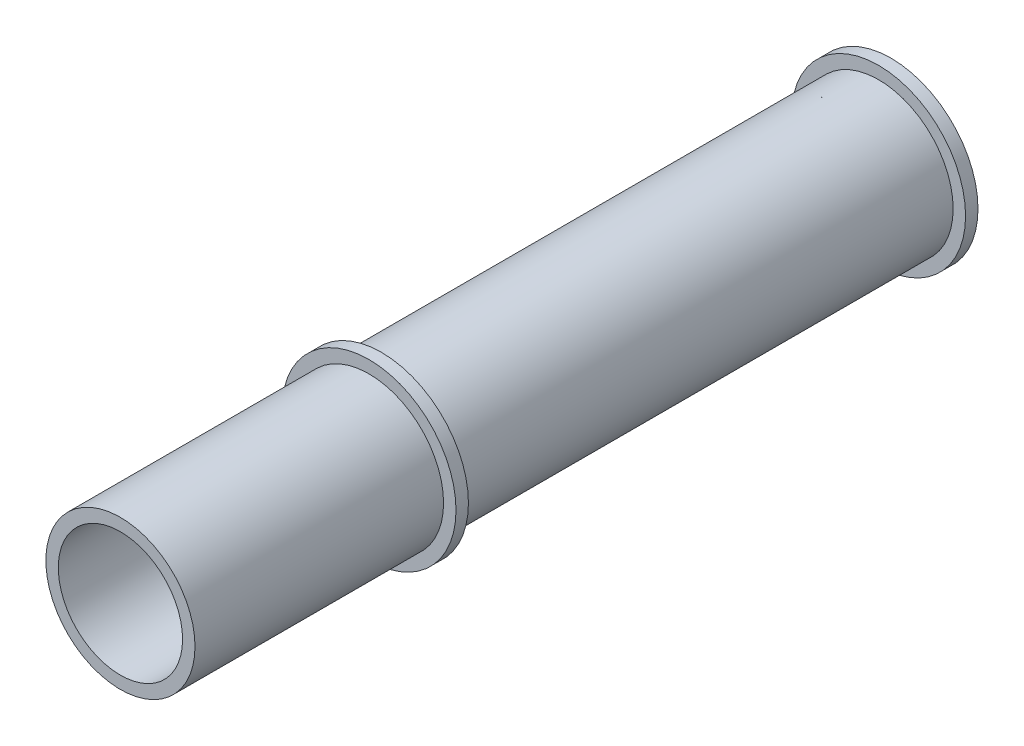
ISO-10303-21;
HEADER;
FILE_DESCRIPTION(('STEP AP214'),'2;1');
FILE_NAME('part.step','',(''),(''),'','','');
FILE_SCHEMA(('AUTOMOTIVE_DESIGN { 1 0 10303 214 1 1 1 1 }'));
ENDSEC;
DATA;
#1=APPLICATION_CONTEXT('core data for automotive mechanical design processes');
#2=APPLICATION_PROTOCOL_DEFINITION('international standard','automotive_design',2000,#1);
#3=PRODUCT_CONTEXT('',#1,'mechanical');
#4=PRODUCT('Part','Part','',(#3));
#5=PRODUCT_RELATED_PRODUCT_CATEGORY('part','',(#4));
#6=PRODUCT_DEFINITION_FORMATION('','',#4);
#7=PRODUCT_DEFINITION_CONTEXT('part definition',#1,'design');
#8=PRODUCT_DEFINITION('design','',#6,#7);
#9=PRODUCT_DEFINITION_SHAPE('','',#8);
#10=(LENGTH_UNIT() NAMED_UNIT(*) SI_UNIT(.MILLI.,.METRE.));
#11=(NAMED_UNIT(*) PLANE_ANGLE_UNIT() SI_UNIT($,.RADIAN.));
#12=(NAMED_UNIT(*) SI_UNIT($,.STERADIAN.) SOLID_ANGLE_UNIT());
#13=UNCERTAINTY_MEASURE_WITH_UNIT(LENGTH_MEASURE(1.E-05),#10,'distance_accuracy_value','');
#14=(GEOMETRIC_REPRESENTATION_CONTEXT(3) GLOBAL_UNCERTAINTY_ASSIGNED_CONTEXT((#13)) GLOBAL_UNIT_ASSIGNED_CONTEXT((#10,
#11,#12)) REPRESENTATION_CONTEXT('',''));
#15=CARTESIAN_POINT('',(0.,0.,0.));
#16=DIRECTION('',(0.,0.,1.));
#17=DIRECTION('',(1.,0.,0.));
#18=AXIS2_PLACEMENT_3D('',#15,#16,#17);
#19=CARTESIAN_POINT('',(0.,0.,40.));
#20=DIRECTION('',(0.,0.,-1.));
#21=DIRECTION('',(-1.,0.,0.));
#22=AXIS2_PLACEMENT_3D('',#19,#20,#21);
#23=CYLINDRICAL_SURFACE('',#22,6.);
#24=CARTESIAN_POINT('',(0.,0.,40.));
#25=DIRECTION('',(0.,0.,1.));
#26=DIRECTION('',(1.,0.,0.));
#27=AXIS2_PLACEMENT_3D('',#24,#25,#26);
#28=CIRCLE('',#27,6.);
#29=CARTESIAN_POINT('',(6.,0.,40.));
#30=VERTEX_POINT('',#29);
#31=EDGE_CURVE('E38',#30,#30,#28,.T.);
#32=ORIENTED_EDGE('',*,*,#31,.F.);
#33=EDGE_LOOP('',(#32));
#34=FACE_BOUND('',#33,.T.);
#35=CARTESIAN_POINT('',(0.,0.,0.));
#36=DIRECTION('',(0.,0.,1.));
#37=DIRECTION('',(1.,0.,0.));
#38=AXIS2_PLACEMENT_3D('',#35,#36,#37);
#39=CIRCLE('',#38,6.);
#40=CARTESIAN_POINT('',(6.,0.,0.));
#41=VERTEX_POINT('',#40);
#42=EDGE_CURVE('E34',#41,#41,#39,.T.);
#43=ORIENTED_EDGE('',*,*,#42,.T.);
#44=EDGE_LOOP('',(#43));
#45=FACE_BOUND('',#44,.T.);
#46=ADVANCED_FACE('F31',(#34,#45),#23,.T.);
#47=CARTESIAN_POINT('',(0.,0.,-1.));
#48=DIRECTION('',(0.,0.,1.));
#49=DIRECTION('',(1.,0.,0.));
#50=AXIS2_PLACEMENT_3D('',#47,#48,#49);
#51=CYLINDRICAL_SURFACE('',#50,7.);
#52=CARTESIAN_POINT('',(0.,0.,-1.));
#53=DIRECTION('',(0.,0.,-1.));
#54=DIRECTION('',(-1.,0.,0.));
#55=AXIS2_PLACEMENT_3D('',#52,#53,#54);
#56=CIRCLE('',#55,7.);
#57=CARTESIAN_POINT('',(-7.,0.,-1.));
#58=VERTEX_POINT('',#57);
#59=EDGE_CURVE('E54',#58,#58,#56,.T.);
#60=ORIENTED_EDGE('',*,*,#59,.F.);
#61=EDGE_LOOP('',(#60));
#62=FACE_BOUND('',#61,.T.);
#63=CARTESIAN_POINT('',(0.,0.,0.));
#64=DIRECTION('',(0.,0.,-1.));
#65=DIRECTION('',(-1.,0.,0.));
#66=AXIS2_PLACEMENT_3D('',#63,#64,#65);
#67=CIRCLE('',#66,7.);
#68=CARTESIAN_POINT('',(-7.,0.,0.));
#69=VERTEX_POINT('',#68);
#70=EDGE_CURVE('E50',#69,#69,#67,.T.);
#71=ORIENTED_EDGE('',*,*,#70,.T.);
#72=EDGE_LOOP('',(#71));
#73=FACE_BOUND('',#72,.T.);
#74=ADVANCED_FACE('F60',(#62,#73),#51,.T.);
#75=CARTESIAN_POINT('',(0.,0.,-1.));
#76=DIRECTION('',(0.,0.,-1.));
#77=DIRECTION('',(-1.,0.,0.));
#78=AXIS2_PLACEMENT_3D('',#75,#76,#77);
#79=PLANE('',#78);
#80=CARTESIAN_POINT('',(0.,0.,-1.));
#81=DIRECTION('',(0.,0.,-1.));
#82=DIRECTION('',(-1.,0.,0.));
#83=AXIS2_PLACEMENT_3D('',#80,#81,#82);
#84=CIRCLE('',#83,5.);
#85=CARTESIAN_POINT('',(-5.,0.,-1.));
#86=VERTEX_POINT('',#85);
#87=EDGE_CURVE('E116',#86,#86,#84,.T.);
#88=ORIENTED_EDGE('',*,*,#87,.F.);
#89=EDGE_LOOP('',(#88));
#90=FACE_BOUND('',#89,.T.);
#91=ORIENTED_EDGE('',*,*,#59,.T.);
#92=EDGE_LOOP('',(#91));
#93=FACE_BOUND('',#92,.T.);
#94=ADVANCED_FACE('F65',(#90,#93),#79,.T.);
#95=CARTESIAN_POINT('',(0.,0.,0.));
#96=DIRECTION('',(0.,0.,-1.));
#97=DIRECTION('',(-1.,0.,0.));
#98=AXIS2_PLACEMENT_3D('',#95,#96,#97);
#99=PLANE('',#98);
#100=ORIENTED_EDGE('',*,*,#42,.F.);
#101=EDGE_LOOP('',(#100));
#102=FACE_BOUND('',#101,.T.);
#103=ORIENTED_EDGE('',*,*,#70,.F.);
#104=EDGE_LOOP('',(#103));
#105=FACE_BOUND('',#104,.T.);
#106=ADVANCED_FACE('F62',(#102,#105),#99,.F.);
#107=CARTESIAN_POINT('',(0.,0.,41.));
#108=DIRECTION('',(0.,0.,-1.));
#109=DIRECTION('',(-1.,0.,0.));
#110=AXIS2_PLACEMENT_3D('',#107,#108,#109);
#111=CYLINDRICAL_SURFACE('',#110,7.);
#112=CARTESIAN_POINT('',(0.,0.,41.));
#113=DIRECTION('',(0.,0.,1.));
#114=DIRECTION('',(1.,0.,0.));
#115=AXIS2_PLACEMENT_3D('',#112,#113,#114);
#116=CIRCLE('',#115,7.);
#117=CARTESIAN_POINT('',(7.,0.,41.));
#118=VERTEX_POINT('',#117);
#119=EDGE_CURVE('E47',#118,#118,#116,.T.);
#120=ORIENTED_EDGE('',*,*,#119,.F.);
#121=EDGE_LOOP('',(#120));
#122=FACE_BOUND('',#121,.T.);
#123=CARTESIAN_POINT('',(0.,0.,40.));
#124=DIRECTION('',(0.,0.,1.));
#125=DIRECTION('',(1.,0.,0.));
#126=AXIS2_PLACEMENT_3D('',#123,#124,#125);
#127=CIRCLE('',#126,7.);
#128=CARTESIAN_POINT('',(7.,0.,40.));
#129=VERTEX_POINT('',#128);
#130=EDGE_CURVE('E51',#129,#129,#127,.T.);
#131=ORIENTED_EDGE('',*,*,#130,.T.);
#132=EDGE_LOOP('',(#131));
#133=FACE_BOUND('',#132,.T.);
#134=ADVANCED_FACE('F64',(#122,#133),#111,.T.);
#135=CARTESIAN_POINT('',(0.,0.,41.));
#136=DIRECTION('',(0.,0.,1.));
#137=DIRECTION('',(1.,0.,0.));
#138=AXIS2_PLACEMENT_3D('',#135,#136,#137);
#139=PLANE('',#138);
#140=CARTESIAN_POINT('',(0.,0.,41.));
#141=DIRECTION('',(0.,0.,1.));
#142=DIRECTION('',(1.,0.,0.));
#143=AXIS2_PLACEMENT_3D('',#140,#141,#142);
#144=CIRCLE('',#143,6.);
#145=CARTESIAN_POINT('',(6.,0.,41.));
#146=VERTEX_POINT('',#145);
#147=EDGE_CURVE('E10',#146,#146,#144,.T.);
#148=ORIENTED_EDGE('',*,*,#147,.F.);
#149=EDGE_LOOP('',(#148));
#150=FACE_BOUND('',#149,.T.);
#151=ORIENTED_EDGE('',*,*,#119,.T.);
#152=EDGE_LOOP('',(#151));
#153=FACE_BOUND('',#152,.T.);
#154=ADVANCED_FACE('F72',(#150,#153),#139,.T.);
#155=CARTESIAN_POINT('',(0.,0.,40.));
#156=DIRECTION('',(0.,0.,1.));
#157=DIRECTION('',(1.,0.,0.));
#158=AXIS2_PLACEMENT_3D('',#155,#156,#157);
#159=PLANE('',#158);
#160=ORIENTED_EDGE('',*,*,#31,.T.);
#161=EDGE_LOOP('',(#160));
#162=FACE_BOUND('',#161,.T.);
#163=ORIENTED_EDGE('',*,*,#130,.F.);
#164=EDGE_LOOP('',(#163));
#165=FACE_BOUND('',#164,.T.);
#166=ADVANCED_FACE('F88',(#162,#165),#159,.F.);
#167=CARTESIAN_POINT('',(0.,0.,61.));
#168=DIRECTION('',(0.,0.,-1.));
#169=DIRECTION('',(-1.,0.,0.));
#170=AXIS2_PLACEMENT_3D('',#167,#168,#169);
#171=CYLINDRICAL_SURFACE('',#170,6.);
#172=CARTESIAN_POINT('',(0.,0.,61.));
#173=DIRECTION('',(0.,0.,1.));
#174=DIRECTION('',(1.,0.,0.));
#175=AXIS2_PLACEMENT_3D('',#172,#173,#174);
#176=CIRCLE('',#175,6.);
#177=CARTESIAN_POINT('',(6.,0.,61.));
#178=VERTEX_POINT('',#177);
#179=EDGE_CURVE('E45',#178,#178,#176,.T.);
#180=ORIENTED_EDGE('',*,*,#179,.F.);
#181=EDGE_LOOP('',(#180));
#182=FACE_BOUND('',#181,.T.);
#183=ORIENTED_EDGE('',*,*,#147,.T.);
#184=EDGE_LOOP('',(#183));
#185=FACE_BOUND('',#184,.T.);
#186=ADVANCED_FACE('F91',(#182,#185),#171,.T.);
#187=CARTESIAN_POINT('',(0.,0.,61.));
#188=DIRECTION('',(0.,0.,1.));
#189=DIRECTION('',(1.,0.,0.));
#190=AXIS2_PLACEMENT_3D('',#187,#188,#189);
#191=PLANE('',#190);
#192=CARTESIAN_POINT('',(0.,0.,61.));
#193=DIRECTION('',(0.,0.,1.));
#194=DIRECTION('',(1.,0.,0.));
#195=AXIS2_PLACEMENT_3D('',#192,#193,#194);
#196=CIRCLE('',#195,5.);
#197=CARTESIAN_POINT('',(5.,0.,61.));
#198=VERTEX_POINT('',#197);
#199=EDGE_CURVE('E119',#198,#198,#196,.T.);
#200=ORIENTED_EDGE('',*,*,#199,.F.);
#201=EDGE_LOOP('',(#200));
#202=FACE_BOUND('',#201,.T.);
#203=ORIENTED_EDGE('',*,*,#179,.T.);
#204=EDGE_LOOP('',(#203));
#205=FACE_BOUND('',#204,.T.);
#206=ADVANCED_FACE('F99',(#202,#205),#191,.T.);
#207=CARTESIAN_POINT('',(0.,0.,-139.));
#208=DIRECTION('',(0.,0.,1.));
#209=DIRECTION('',(1.,0.,0.));
#210=AXIS2_PLACEMENT_3D('',#207,#208,#209);
#211=CYLINDRICAL_SURFACE('',#210,5.);
#212=ORIENTED_EDGE('',*,*,#87,.T.);
#213=EDGE_LOOP('',(#212));
#214=FACE_BOUND('',#213,.T.);
#215=ORIENTED_EDGE('',*,*,#199,.T.);
#216=EDGE_LOOP('',(#215));
#217=FACE_BOUND('',#216,.T.);
#218=ADVANCED_FACE('F107',(#214,#217),#211,.F.);
#219=CLOSED_SHELL('',(#46,#74,#94,#106,#134,#154,#166,#186,#206,#218));
#220=MANIFOLD_SOLID_BREP('B2',#219);
#221=ADVANCED_BREP_SHAPE_REPRESENTATION('',(#18,#220),#14);
#222=SHAPE_DEFINITION_REPRESENTATION(#9,#221);
ENDSEC;
END-ISO-10303-21;
